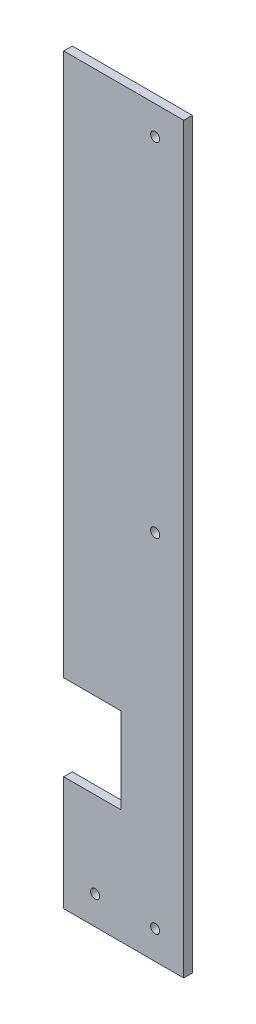
ISO-10303-21;
HEADER;
FILE_DESCRIPTION(('STEP AP214'),'2;1');
FILE_NAME('part.step','',(''),(''),'','','');
FILE_SCHEMA(('AUTOMOTIVE_DESIGN { 1 0 10303 214 1 1 1 1 }'));
ENDSEC;
DATA;
#1=APPLICATION_CONTEXT('core data for automotive mechanical design processes');
#2=APPLICATION_PROTOCOL_DEFINITION('international standard','automotive_design',2000,#1);
#3=PRODUCT_CONTEXT('',#1,'mechanical');
#4=PRODUCT('Part','Part','',(#3));
#5=PRODUCT_RELATED_PRODUCT_CATEGORY('part','',(#4));
#6=PRODUCT_DEFINITION_FORMATION('','',#4);
#7=PRODUCT_DEFINITION_CONTEXT('part definition',#1,'design');
#8=PRODUCT_DEFINITION('design','',#6,#7);
#9=PRODUCT_DEFINITION_SHAPE('','',#8);
#10=(LENGTH_UNIT() NAMED_UNIT(*) SI_UNIT(.MILLI.,.METRE.));
#11=(NAMED_UNIT(*) PLANE_ANGLE_UNIT() SI_UNIT($,.RADIAN.));
#12=(NAMED_UNIT(*) SI_UNIT($,.STERADIAN.) SOLID_ANGLE_UNIT());
#13=UNCERTAINTY_MEASURE_WITH_UNIT(LENGTH_MEASURE(1.E-05),#10,'distance_accuracy_value','');
#14=(GEOMETRIC_REPRESENTATION_CONTEXT(3) GLOBAL_UNCERTAINTY_ASSIGNED_CONTEXT((#13)) GLOBAL_UNIT_ASSIGNED_CONTEXT((#10,
#11,#12)) REPRESENTATION_CONTEXT('',''));
#15=CARTESIAN_POINT('',(0.,0.,0.));
#16=DIRECTION('',(0.,0.,1.));
#17=DIRECTION('',(1.,0.,0.));
#18=AXIS2_PLACEMENT_3D('',#15,#16,#17);
#19=CARTESIAN_POINT('',(0.,0.,3.));
#20=DIRECTION('',(1.,0.,0.));
#21=DIRECTION('',(0.,1.,0.));
#22=AXIS2_PLACEMENT_3D('',#19,#20,#21);
#23=PLANE('',#22);
#24=DIRECTION('',(0.,-1.,0.));
#25=VECTOR('',#24,1.);
#26=CARTESIAN_POINT('',(0.,0.,0.));
#27=LINE('',#26,#25);
#28=CARTESIAN_POINT('',(0.,260.,0.));
#29=VERTEX_POINT('',#28);
#30=CARTESIAN_POINT('',(0.,70.,0.));
#31=VERTEX_POINT('',#30);
#32=EDGE_CURVE('E143',#29,#31,#27,.T.);
#33=ORIENTED_EDGE('',*,*,#32,.T.);
#34=DIRECTION('',(0.,0.,1.));
#35=VECTOR('',#34,1.);
#36=CARTESIAN_POINT('',(0.,70.,-7.));
#37=LINE('',#36,#35);
#38=CARTESIAN_POINT('',(0.,70.,3.));
#39=VERTEX_POINT('',#38);
#40=EDGE_CURVE('E193',#31,#39,#37,.T.);
#41=ORIENTED_EDGE('',*,*,#40,.T.);
#42=DIRECTION('',(0.,-1.,0.));
#43=VECTOR('',#42,1.);
#44=CARTESIAN_POINT('',(0.,0.,3.));
#45=LINE('',#44,#43);
#46=CARTESIAN_POINT('',(0.,260.,3.));
#47=VERTEX_POINT('',#46);
#48=EDGE_CURVE('E129',#47,#39,#45,.T.);
#49=ORIENTED_EDGE('',*,*,#48,.F.);
#50=DIRECTION('',(0.,0.,-1.));
#51=VECTOR('',#50,1.);
#52=CARTESIAN_POINT('',(0.,260.,3.));
#53=LINE('',#52,#51);
#54=EDGE_CURVE('E142',#47,#29,#53,.T.);
#55=ORIENTED_EDGE('',*,*,#54,.T.);
#56=EDGE_LOOP('',(#33,#41,#49,#55));
#57=FACE_BOUND('',#56,.T.);
#58=ADVANCED_FACE('F39',(#57),#23,.F.);
#59=CARTESIAN_POINT('',(0.,40.,3.));
#60=VERTEX_POINT('',#59);
#61=CARTESIAN_POINT('',(0.,0.,3.));
#62=VERTEX_POINT('',#61);
#63=EDGE_CURVE('E91',#60,#62,#45,.T.);
#64=ORIENTED_EDGE('',*,*,#63,.F.);
#65=DIRECTION('',(0.,0.,1.));
#66=VECTOR('',#65,1.);
#67=CARTESIAN_POINT('',(0.,40.,-7.));
#68=LINE('',#67,#66);
#69=CARTESIAN_POINT('',(0.,40.,0.));
#70=VERTEX_POINT('',#69);
#71=EDGE_CURVE('E111',#70,#60,#68,.T.);
#72=ORIENTED_EDGE('',*,*,#71,.F.);
#73=CARTESIAN_POINT('',(0.,0.,0.));
#74=VERTEX_POINT('',#73);
#75=EDGE_CURVE('E147',#70,#74,#27,.T.);
#76=ORIENTED_EDGE('',*,*,#75,.T.);
#77=DIRECTION('',(0.,0.,-1.));
#78=VECTOR('',#77,1.);
#79=CARTESIAN_POINT('',(0.,0.,3.));
#80=LINE('',#79,#78);
#81=EDGE_CURVE('E128',#62,#74,#80,.T.);
#82=ORIENTED_EDGE('',*,*,#81,.F.);
#83=EDGE_LOOP('',(#64,#72,#76,#82));
#84=FACE_BOUND('',#83,.T.);
#85=ADVANCED_FACE('F41',(#84),#23,.F.);
#86=CARTESIAN_POINT('',(0.,0.,3.));
#87=DIRECTION('',(0.,1.,0.));
#88=DIRECTION('',(0.,0.,1.));
#89=AXIS2_PLACEMENT_3D('',#86,#87,#88);
#90=PLANE('',#89);
#91=DIRECTION('',(1.,0.,0.));
#92=VECTOR('',#91,1.);
#93=CARTESIAN_POINT('',(0.,0.,0.));
#94=LINE('',#93,#92);
#95=CARTESIAN_POINT('',(42.,0.,0.));
#96=VERTEX_POINT('',#95);
#97=EDGE_CURVE('E146',#74,#96,#94,.T.);
#98=ORIENTED_EDGE('',*,*,#97,.T.);
#99=DIRECTION('',(0.,0.,-1.));
#100=VECTOR('',#99,1.);
#101=CARTESIAN_POINT('',(42.,0.,3.));
#102=LINE('',#101,#100);
#103=CARTESIAN_POINT('',(42.,0.,3.));
#104=VERTEX_POINT('',#103);
#105=EDGE_CURVE('E153',#104,#96,#102,.T.);
#106=ORIENTED_EDGE('',*,*,#105,.F.);
#107=DIRECTION('',(1.,0.,0.));
#108=VECTOR('',#107,1.);
#109=CARTESIAN_POINT('',(0.,0.,3.));
#110=LINE('',#109,#108);
#111=EDGE_CURVE('E131',#62,#104,#110,.T.);
#112=ORIENTED_EDGE('',*,*,#111,.F.);
#113=ORIENTED_EDGE('',*,*,#81,.T.);
#114=EDGE_LOOP('',(#98,#106,#112,#113));
#115=FACE_BOUND('',#114,.T.);
#116=ADVANCED_FACE('F220',(#115),#90,.F.);
#117=CARTESIAN_POINT('',(42.,0.,3.));
#118=DIRECTION('',(-1.,0.,0.));
#119=DIRECTION('',(0.,-1.,0.));
#120=AXIS2_PLACEMENT_3D('',#117,#118,#119);
#121=PLANE('',#120);
#122=DIRECTION('',(0.,1.,0.));
#123=VECTOR('',#122,1.);
#124=CARTESIAN_POINT('',(42.,0.,0.));
#125=LINE('',#124,#123);
#126=CARTESIAN_POINT('',(42.,260.,0.));
#127=VERTEX_POINT('',#126);
#128=EDGE_CURVE('E132',#96,#127,#125,.T.);
#129=ORIENTED_EDGE('',*,*,#128,.T.);
#130=DIRECTION('',(0.,0.,-1.));
#131=VECTOR('',#130,1.);
#132=CARTESIAN_POINT('',(42.,260.,3.));
#133=LINE('',#132,#131);
#134=CARTESIAN_POINT('',(42.,260.,3.));
#135=VERTEX_POINT('',#134);
#136=EDGE_CURVE('E151',#135,#127,#133,.T.);
#137=ORIENTED_EDGE('',*,*,#136,.F.);
#138=DIRECTION('',(0.,1.,0.));
#139=VECTOR('',#138,1.);
#140=CARTESIAN_POINT('',(42.,0.,3.));
#141=LINE('',#140,#139);
#142=EDGE_CURVE('E139',#104,#135,#141,.T.);
#143=ORIENTED_EDGE('',*,*,#142,.F.);
#144=ORIENTED_EDGE('',*,*,#105,.T.);
#145=EDGE_LOOP('',(#129,#137,#143,#144));
#146=FACE_BOUND('',#145,.T.);
#147=ADVANCED_FACE('F207',(#146),#121,.F.);
#148=CARTESIAN_POINT('',(0.,260.,3.));
#149=DIRECTION('',(0.,-1.,0.));
#150=DIRECTION('',(0.,0.,-1.));
#151=AXIS2_PLACEMENT_3D('',#148,#149,#150);
#152=PLANE('',#151);
#153=DIRECTION('',(-1.,0.,0.));
#154=VECTOR('',#153,1.);
#155=CARTESIAN_POINT('',(0.,260.,0.));
#156=LINE('',#155,#154);
#157=EDGE_CURVE('E84',#127,#29,#156,.T.);
#158=ORIENTED_EDGE('',*,*,#157,.T.);
#159=ORIENTED_EDGE('',*,*,#54,.F.);
#160=DIRECTION('',(-1.,0.,0.));
#161=VECTOR('',#160,1.);
#162=CARTESIAN_POINT('',(0.,260.,3.));
#163=LINE('',#162,#161);
#164=EDGE_CURVE('E63',#135,#47,#163,.T.);
#165=ORIENTED_EDGE('',*,*,#164,.F.);
#166=ORIENTED_EDGE('',*,*,#136,.T.);
#167=EDGE_LOOP('',(#158,#159,#165,#166));
#168=FACE_BOUND('',#167,.T.);
#169=ADVANCED_FACE('F210',(#168),#152,.F.);
#170=CARTESIAN_POINT('',(0.,0.,3.));
#171=DIRECTION('',(0.,0.,-1.));
#172=DIRECTION('',(-1.,0.,0.));
#173=AXIS2_PLACEMENT_3D('',#170,#171,#172);
#174=PLANE('',#173);
#175=CARTESIAN_POINT('',(11.,10.,3.));
#176=DIRECTION('',(0.,0.,1.));
#177=DIRECTION('',(1.,0.,0.));
#178=AXIS2_PLACEMENT_3D('',#175,#176,#177);
#179=CIRCLE('',#178,1.59999999999999);
#180=CARTESIAN_POINT('',(12.6,10.,3.));
#181=VERTEX_POINT('',#180);
#182=EDGE_CURVE('E191',#181,#181,#179,.T.);
#183=ORIENTED_EDGE('',*,*,#182,.F.);
#184=EDGE_LOOP('',(#183));
#185=FACE_BOUND('',#184,.T.);
#186=CARTESIAN_POINT('',(32.,250.,3.));
#187=DIRECTION('',(0.,0.,1.));
#188=DIRECTION('',(1.,0.,0.));
#189=AXIS2_PLACEMENT_3D('',#186,#187,#188);
#190=CIRCLE('',#189,1.59999999999999);
#191=CARTESIAN_POINT('',(33.6,250.,3.));
#192=VERTEX_POINT('',#191);
#193=EDGE_CURVE('E185',#192,#192,#190,.T.);
#194=ORIENTED_EDGE('',*,*,#193,.F.);
#195=EDGE_LOOP('',(#194));
#196=FACE_BOUND('',#195,.T.);
#197=CARTESIAN_POINT('',(32.,10.,3.));
#198=DIRECTION('',(0.,0.,1.));
#199=DIRECTION('',(1.,0.,0.));
#200=AXIS2_PLACEMENT_3D('',#197,#198,#199);
#201=CIRCLE('',#200,1.59999999999999);
#202=CARTESIAN_POINT('',(33.6,10.,3.));
#203=VERTEX_POINT('',#202);
#204=EDGE_CURVE('E177',#203,#203,#201,.T.);
#205=ORIENTED_EDGE('',*,*,#204,.F.);
#206=EDGE_LOOP('',(#205));
#207=FACE_BOUND('',#206,.T.);
#208=CARTESIAN_POINT('',(32.,130.,3.));
#209=DIRECTION('',(0.,0.,1.));
#210=DIRECTION('',(1.,0.,0.));
#211=AXIS2_PLACEMENT_3D('',#208,#209,#210);
#212=CIRCLE('',#211,1.59999999999999);
#213=CARTESIAN_POINT('',(33.6,130.,3.));
#214=VERTEX_POINT('',#213);
#215=EDGE_CURVE('E169',#214,#214,#212,.T.);
#216=ORIENTED_EDGE('',*,*,#215,.F.);
#217=EDGE_LOOP('',(#216));
#218=FACE_BOUND('',#217,.T.);
#219=ORIENTED_EDGE('',*,*,#48,.T.);
#220=DIRECTION('',(-1.,0.,0.));
#221=VECTOR('',#220,1.);
#222=CARTESIAN_POINT('',(0.,70.,3.));
#223=LINE('',#222,#221);
#224=CARTESIAN_POINT('',(20.,70.,3.));
#225=VERTEX_POINT('',#224);
#226=EDGE_CURVE('E119',#225,#39,#223,.T.);
#227=ORIENTED_EDGE('',*,*,#226,.F.);
#228=DIRECTION('',(0.,1.,0.));
#229=VECTOR('',#228,1.);
#230=CARTESIAN_POINT('',(20.,40.,3.));
#231=LINE('',#230,#229);
#232=CARTESIAN_POINT('',(20.,40.,3.));
#233=VERTEX_POINT('',#232);
#234=EDGE_CURVE('E124',#233,#225,#231,.T.);
#235=ORIENTED_EDGE('',*,*,#234,.F.);
#236=DIRECTION('',(1.,0.,0.));
#237=VECTOR('',#236,1.);
#238=CARTESIAN_POINT('',(0.,40.,3.));
#239=LINE('',#238,#237);
#240=EDGE_CURVE('E113',#60,#233,#239,.T.);
#241=ORIENTED_EDGE('',*,*,#240,.F.);
#242=ORIENTED_EDGE('',*,*,#63,.T.);
#243=ORIENTED_EDGE('',*,*,#111,.T.);
#244=ORIENTED_EDGE('',*,*,#142,.T.);
#245=ORIENTED_EDGE('',*,*,#164,.T.);
#246=EDGE_LOOP('',(#219,#227,#235,#241,#242,#243,#244,#245));
#247=FACE_BOUND('',#246,.T.);
#248=ADVANCED_FACE('F121',(#185,#196,#207,#218,#247),#174,.F.);
#249=CARTESIAN_POINT('',(0.,0.,0.));
#250=DIRECTION('',(0.,0.,-1.));
#251=DIRECTION('',(-1.,0.,0.));
#252=AXIS2_PLACEMENT_3D('',#249,#250,#251);
#253=PLANE('',#252);
#254=DIRECTION('',(1.,0.,0.));
#255=VECTOR('',#254,1.);
#256=CARTESIAN_POINT('',(0.,70.,0.));
#257=LINE('',#256,#255);
#258=CARTESIAN_POINT('',(20.,70.,0.));
#259=VERTEX_POINT('',#258);
#260=EDGE_CURVE('E11',#31,#259,#257,.T.);
#261=ORIENTED_EDGE('',*,*,#260,.F.);
#262=ORIENTED_EDGE('',*,*,#32,.F.);
#263=ORIENTED_EDGE('',*,*,#157,.F.);
#264=ORIENTED_EDGE('',*,*,#128,.F.);
#265=ORIENTED_EDGE('',*,*,#97,.F.);
#266=ORIENTED_EDGE('',*,*,#75,.F.);
#267=DIRECTION('',(-1.,0.,0.));
#268=VECTOR('',#267,1.);
#269=CARTESIAN_POINT('',(0.,40.,0.));
#270=LINE('',#269,#268);
#271=CARTESIAN_POINT('',(20.,40.,0.));
#272=VERTEX_POINT('',#271);
#273=EDGE_CURVE('E116',#272,#70,#270,.T.);
#274=ORIENTED_EDGE('',*,*,#273,.F.);
#275=DIRECTION('',(0.,-1.,0.));
#276=VECTOR('',#275,1.);
#277=CARTESIAN_POINT('',(20.,0.,0.));
#278=LINE('',#277,#276);
#279=EDGE_CURVE('E47',#259,#272,#278,.T.);
#280=ORIENTED_EDGE('',*,*,#279,.F.);
#281=EDGE_LOOP('',(#261,#262,#263,#264,#265,#266,#274,#280));
#282=FACE_BOUND('',#281,.T.);
#283=CARTESIAN_POINT('',(11.,10.,0.));
#284=DIRECTION('',(0.,0.,1.));
#285=DIRECTION('',(1.,0.,0.));
#286=AXIS2_PLACEMENT_3D('',#283,#284,#285);
#287=CIRCLE('',#286,1.6);
#288=CARTESIAN_POINT('',(12.6,10.,0.));
#289=VERTEX_POINT('',#288);
#290=EDGE_CURVE('E188',#289,#289,#287,.T.);
#291=ORIENTED_EDGE('',*,*,#290,.T.);
#292=EDGE_LOOP('',(#291));
#293=FACE_BOUND('',#292,.T.);
#294=CARTESIAN_POINT('',(32.,250.,0.));
#295=DIRECTION('',(0.,0.,1.));
#296=DIRECTION('',(1.,0.,0.));
#297=AXIS2_PLACEMENT_3D('',#294,#295,#296);
#298=CIRCLE('',#297,1.6);
#299=CARTESIAN_POINT('',(33.6,250.,0.));
#300=VERTEX_POINT('',#299);
#301=EDGE_CURVE('E182',#300,#300,#298,.T.);
#302=ORIENTED_EDGE('',*,*,#301,.T.);
#303=EDGE_LOOP('',(#302));
#304=FACE_BOUND('',#303,.T.);
#305=CARTESIAN_POINT('',(32.,10.,0.));
#306=DIRECTION('',(0.,0.,1.));
#307=DIRECTION('',(1.,0.,0.));
#308=AXIS2_PLACEMENT_3D('',#305,#306,#307);
#309=CIRCLE('',#308,1.6);
#310=CARTESIAN_POINT('',(33.6,10.,0.));
#311=VERTEX_POINT('',#310);
#312=EDGE_CURVE('E173',#311,#311,#309,.T.);
#313=ORIENTED_EDGE('',*,*,#312,.T.);
#314=EDGE_LOOP('',(#313));
#315=FACE_BOUND('',#314,.T.);
#316=CARTESIAN_POINT('',(32.,130.,0.));
#317=DIRECTION('',(0.,0.,1.));
#318=DIRECTION('',(1.,0.,0.));
#319=AXIS2_PLACEMENT_3D('',#316,#317,#318);
#320=CIRCLE('',#319,1.6);
#321=CARTESIAN_POINT('',(33.6,130.,0.));
#322=VERTEX_POINT('',#321);
#323=EDGE_CURVE('E136',#322,#322,#320,.T.);
#324=ORIENTED_EDGE('',*,*,#323,.T.);
#325=EDGE_LOOP('',(#324));
#326=FACE_BOUND('',#325,.T.);
#327=ADVANCED_FACE('F164',(#282,#293,#304,#315,#326),#253,.T.);
#328=CARTESIAN_POINT('',(32.,130.,3.));
#329=DIRECTION('',(0.,0.,1.));
#330=DIRECTION('',(1.,0.,0.));
#331=AXIS2_PLACEMENT_3D('',#328,#329,#330);
#332=CYLINDRICAL_SURFACE('',#331,1.59999999999999);
#333=ORIENTED_EDGE('',*,*,#323,.F.);
#334=EDGE_LOOP('',(#333));
#335=FACE_BOUND('',#334,.T.);
#336=ORIENTED_EDGE('',*,*,#215,.T.);
#337=EDGE_LOOP('',(#336));
#338=FACE_BOUND('',#337,.T.);
#339=ADVANCED_FACE('F259',(#335,#338),#332,.F.);
#340=CARTESIAN_POINT('',(32.,10.,3.));
#341=DIRECTION('',(0.,0.,1.));
#342=DIRECTION('',(1.,0.,0.));
#343=AXIS2_PLACEMENT_3D('',#340,#341,#342);
#344=CYLINDRICAL_SURFACE('',#343,1.59999999999999);
#345=ORIENTED_EDGE('',*,*,#312,.F.);
#346=EDGE_LOOP('',(#345));
#347=FACE_BOUND('',#346,.T.);
#348=ORIENTED_EDGE('',*,*,#204,.T.);
#349=EDGE_LOOP('',(#348));
#350=FACE_BOUND('',#349,.T.);
#351=ADVANCED_FACE('F267',(#347,#350),#344,.F.);
#352=CARTESIAN_POINT('',(32.,250.,3.));
#353=DIRECTION('',(0.,0.,1.));
#354=DIRECTION('',(1.,0.,0.));
#355=AXIS2_PLACEMENT_3D('',#352,#353,#354);
#356=CYLINDRICAL_SURFACE('',#355,1.59999999999999);
#357=ORIENTED_EDGE('',*,*,#301,.F.);
#358=EDGE_LOOP('',(#357));
#359=FACE_BOUND('',#358,.T.);
#360=ORIENTED_EDGE('',*,*,#193,.T.);
#361=EDGE_LOOP('',(#360));
#362=FACE_BOUND('',#361,.T.);
#363=ADVANCED_FACE('F277',(#359,#362),#356,.F.);
#364=CARTESIAN_POINT('',(11.,10.,3.));
#365=DIRECTION('',(0.,0.,1.));
#366=DIRECTION('',(1.,0.,0.));
#367=AXIS2_PLACEMENT_3D('',#364,#365,#366);
#368=CYLINDRICAL_SURFACE('',#367,1.59999999999999);
#369=ORIENTED_EDGE('',*,*,#290,.F.);
#370=EDGE_LOOP('',(#369));
#371=FACE_BOUND('',#370,.T.);
#372=ORIENTED_EDGE('',*,*,#182,.T.);
#373=EDGE_LOOP('',(#372));
#374=FACE_BOUND('',#373,.T.);
#375=ADVANCED_FACE('F287',(#371,#374),#368,.F.);
#376=CARTESIAN_POINT('',(0.,70.,-7.));
#377=DIRECTION('',(0.,1.,0.));
#378=DIRECTION('',(0.,0.,1.));
#379=AXIS2_PLACEMENT_3D('',#376,#377,#378);
#380=PLANE('',#379);
#381=ORIENTED_EDGE('',*,*,#260,.T.);
#382=DIRECTION('',(0.,0.,1.));
#383=VECTOR('',#382,1.);
#384=CARTESIAN_POINT('',(20.,70.,-7.));
#385=LINE('',#384,#383);
#386=EDGE_CURVE('E161',#259,#225,#385,.T.);
#387=ORIENTED_EDGE('',*,*,#386,.T.);
#388=ORIENTED_EDGE('',*,*,#226,.T.);
#389=ORIENTED_EDGE('',*,*,#40,.F.);
#390=EDGE_LOOP('',(#381,#387,#388,#389));
#391=FACE_BOUND('',#390,.T.);
#392=ADVANCED_FACE('F202',(#391),#380,.F.);
#393=CARTESIAN_POINT('',(20.,40.,-7.));
#394=DIRECTION('',(1.,0.,0.));
#395=DIRECTION('',(0.,1.,0.));
#396=AXIS2_PLACEMENT_3D('',#393,#394,#395);
#397=PLANE('',#396);
#398=ORIENTED_EDGE('',*,*,#279,.T.);
#399=DIRECTION('',(0.,0.,1.));
#400=VECTOR('',#399,1.);
#401=CARTESIAN_POINT('',(20.,40.,-7.));
#402=LINE('',#401,#400);
#403=EDGE_CURVE('E54',#272,#233,#402,.T.);
#404=ORIENTED_EDGE('',*,*,#403,.T.);
#405=ORIENTED_EDGE('',*,*,#234,.T.);
#406=ORIENTED_EDGE('',*,*,#386,.F.);
#407=EDGE_LOOP('',(#398,#404,#405,#406));
#408=FACE_BOUND('',#407,.T.);
#409=ADVANCED_FACE('F160',(#408),#397,.F.);
#410=CARTESIAN_POINT('',(0.,40.,-7.));
#411=DIRECTION('',(0.,-1.,0.));
#412=DIRECTION('',(1.,0.,0.));
#413=AXIS2_PLACEMENT_3D('',#410,#411,#412);
#414=PLANE('',#413);
#415=ORIENTED_EDGE('',*,*,#273,.T.);
#416=ORIENTED_EDGE('',*,*,#71,.T.);
#417=ORIENTED_EDGE('',*,*,#240,.T.);
#418=ORIENTED_EDGE('',*,*,#403,.F.);
#419=EDGE_LOOP('',(#415,#416,#417,#418));
#420=FACE_BOUND('',#419,.T.);
#421=ADVANCED_FACE('F112',(#420),#414,.F.);
#422=CLOSED_SHELL('',(#58,#85,#116,#147,#169,#248,#327,#339,#351,#363,#375,#392,#409,#421));
#423=MANIFOLD_SOLID_BREP('B2',#422);
#424=ADVANCED_BREP_SHAPE_REPRESENTATION('',(#18,#423),#14);
#425=SHAPE_DEFINITION_REPRESENTATION(#9,#424);
ENDSEC;
END-ISO-10303-21;
